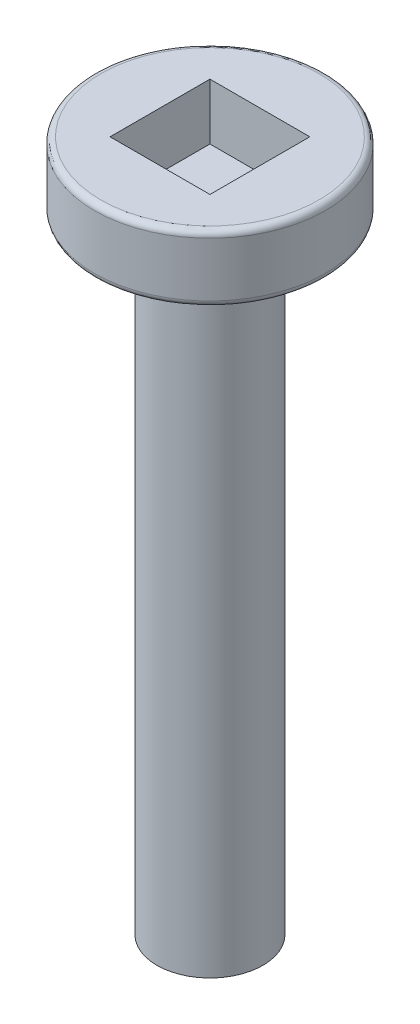
ISO-10303-21;
HEADER;
FILE_DESCRIPTION(('STEP AP214'),'2;1');
FILE_NAME('part.step','',(''),(''),'','','');
FILE_SCHEMA(('AUTOMOTIVE_DESIGN { 1 0 10303 214 1 1 1 1 }'));
ENDSEC;
DATA;
#1=APPLICATION_CONTEXT('core data for automotive mechanical design processes');
#2=APPLICATION_PROTOCOL_DEFINITION('international standard','automotive_design',2000,#1);
#3=PRODUCT_CONTEXT('',#1,'mechanical');
#4=PRODUCT('Part','Part','',(#3));
#5=PRODUCT_RELATED_PRODUCT_CATEGORY('part','',(#4));
#6=PRODUCT_DEFINITION_FORMATION('','',#4);
#7=PRODUCT_DEFINITION_CONTEXT('part definition',#1,'design');
#8=PRODUCT_DEFINITION('design','',#6,#7);
#9=PRODUCT_DEFINITION_SHAPE('','',#8);
#10=(LENGTH_UNIT() NAMED_UNIT(*) SI_UNIT(.MILLI.,.METRE.));
#11=(NAMED_UNIT(*) PLANE_ANGLE_UNIT() SI_UNIT($,.RADIAN.));
#12=(NAMED_UNIT(*) SI_UNIT($,.STERADIAN.) SOLID_ANGLE_UNIT());
#13=UNCERTAINTY_MEASURE_WITH_UNIT(LENGTH_MEASURE(1.E-05),#10,'distance_accuracy_value','');
#14=(GEOMETRIC_REPRESENTATION_CONTEXT(3) GLOBAL_UNCERTAINTY_ASSIGNED_CONTEXT((#13)) GLOBAL_UNIT_ASSIGNED_CONTEXT((#10,
#11,#12)) REPRESENTATION_CONTEXT('',''));
#15=CARTESIAN_POINT('',(0.,0.,0.));
#16=DIRECTION('',(0.,0.,1.));
#17=DIRECTION('',(1.,0.,0.));
#18=AXIS2_PLACEMENT_3D('',#15,#16,#17);
#19=CARTESIAN_POINT('',(0.,-2.7178,0.));
#20=DIRECTION('',(0.,1.,0.));
#21=DIRECTION('',(0.,0.,1.));
#22=AXIS2_PLACEMENT_3D('',#19,#20,#21);
#23=CYLINDRICAL_SURFACE('',#22,4.699);
#24=CARTESIAN_POINT('',(0.,-2.4638,0.));
#25=DIRECTION('',(0.,1.,0.));
#26=DIRECTION('',(0.,0.,1.));
#27=AXIS2_PLACEMENT_3D('',#24,#25,#26);
#28=CIRCLE('',#27,4.699);
#29=CARTESIAN_POINT('',(0.,-2.4638,4.699));
#30=VERTEX_POINT('',#29);
#31=EDGE_CURVE('E122',#30,#30,#28,.T.);
#32=ORIENTED_EDGE('',*,*,#31,.T.);
#33=EDGE_LOOP('',(#32));
#34=FACE_BOUND('',#33,.T.);
#35=CARTESIAN_POINT('',(0.,-0.254,0.));
#36=DIRECTION('',(0.,1.,0.));
#37=DIRECTION('',(0.,0.,1.));
#38=AXIS2_PLACEMENT_3D('',#35,#36,#37);
#39=CIRCLE('',#38,4.699);
#40=CARTESIAN_POINT('',(0.,-0.254,4.699));
#41=VERTEX_POINT('',#40);
#42=EDGE_CURVE('E119',#41,#41,#39,.F.);
#43=ORIENTED_EDGE('',*,*,#42,.T.);
#44=EDGE_LOOP('',(#43));
#45=FACE_BOUND('',#44,.T.);
#46=ADVANCED_FACE('F35',(#34,#45),#23,.T.);
#47=CARTESIAN_POINT('',(0.,-2.7178,0.));
#48=DIRECTION('',(0.,1.,0.));
#49=DIRECTION('',(0.,0.,1.));
#50=AXIS2_PLACEMENT_3D('',#47,#48,#49);
#51=PLANE('',#50);
#52=CARTESIAN_POINT('',(0.,-2.7178,0.));
#53=DIRECTION('',(0.,1.,0.));
#54=DIRECTION('',(0.,0.,1.));
#55=AXIS2_PLACEMENT_3D('',#52,#53,#54);
#56=CIRCLE('',#55,4.445);
#57=CARTESIAN_POINT('',(0.,-2.7178,4.445));
#58=VERTEX_POINT('',#57);
#59=EDGE_CURVE('E43',#58,#58,#56,.F.);
#60=ORIENTED_EDGE('',*,*,#59,.T.);
#61=EDGE_LOOP('',(#60));
#62=FACE_BOUND('',#61,.T.);
#63=CARTESIAN_POINT('',(0.,-2.7178,0.));
#64=DIRECTION('',(0.,1.,0.));
#65=DIRECTION('',(0.,0.,1.));
#66=AXIS2_PLACEMENT_3D('',#63,#64,#65);
#67=CIRCLE('',#66,2.159);
#68=CARTESIAN_POINT('',(0.,-2.7178,2.159));
#69=VERTEX_POINT('',#68);
#70=EDGE_CURVE('E116',#69,#69,#67,.T.);
#71=ORIENTED_EDGE('',*,*,#70,.T.);
#72=EDGE_LOOP('',(#71));
#73=FACE_BOUND('',#72,.T.);
#74=ADVANCED_FACE('F127',(#62,#73),#51,.F.);
#75=CARTESIAN_POINT('',(0.,0.,0.));
#76=DIRECTION('',(0.,1.,0.));
#77=DIRECTION('',(0.,0.,1.));
#78=AXIS2_PLACEMENT_3D('',#75,#76,#77);
#79=PLANE('',#78);
#80=CARTESIAN_POINT('',(0.,0.,0.));
#81=DIRECTION('',(0.,1.,0.));
#82=DIRECTION('',(0.,0.,1.));
#83=AXIS2_PLACEMENT_3D('',#80,#81,#82);
#84=CIRCLE('',#83,4.445);
#85=CARTESIAN_POINT('',(0.,0.,4.445));
#86=VERTEX_POINT('',#85);
#87=EDGE_CURVE('E11',#86,#86,#84,.T.);
#88=ORIENTED_EDGE('',*,*,#87,.T.);
#89=EDGE_LOOP('',(#88));
#90=FACE_BOUND('',#89,.T.);
#91=DIRECTION('',(0.,0.,1.));
#92=VECTOR('',#91,1.);
#93=CARTESIAN_POINT('',(-2.032,0.,-2.032));
#94=LINE('',#93,#92);
#95=CARTESIAN_POINT('',(-2.032,0.,-2.032));
#96=VERTEX_POINT('',#95);
#97=CARTESIAN_POINT('',(-2.032,0.,2.032));
#98=VERTEX_POINT('',#97);
#99=EDGE_CURVE('E50',#96,#98,#94,.T.);
#100=ORIENTED_EDGE('',*,*,#99,.F.);
#101=DIRECTION('',(-1.,0.,0.));
#102=VECTOR('',#101,1.);
#103=CARTESIAN_POINT('',(-2.032,0.,-2.032));
#104=LINE('',#103,#102);
#105=CARTESIAN_POINT('',(2.032,0.,-2.032));
#106=VERTEX_POINT('',#105);
#107=EDGE_CURVE('E101',#106,#96,#104,.T.);
#108=ORIENTED_EDGE('',*,*,#107,.F.);
#109=DIRECTION('',(0.,0.,-1.));
#110=VECTOR('',#109,1.);
#111=CARTESIAN_POINT('',(2.032,0.,-2.032));
#112=LINE('',#111,#110);
#113=CARTESIAN_POINT('',(2.032,0.,2.032));
#114=VERTEX_POINT('',#113);
#115=EDGE_CURVE('E107',#114,#106,#112,.T.);
#116=ORIENTED_EDGE('',*,*,#115,.F.);
#117=DIRECTION('',(1.,0.,0.));
#118=VECTOR('',#117,1.);
#119=CARTESIAN_POINT('',(-2.032,0.,2.032));
#120=LINE('',#119,#118);
#121=EDGE_CURVE('E85',#98,#114,#120,.T.);
#122=ORIENTED_EDGE('',*,*,#121,.F.);
#123=EDGE_LOOP('',(#100,#108,#116,#122));
#124=FACE_BOUND('',#123,.T.);
#125=ADVANCED_FACE('F144',(#90,#124),#79,.T.);
#126=CARTESIAN_POINT('',(0.,-28.1178,0.));
#127=DIRECTION('',(0.,1.,0.));
#128=DIRECTION('',(0.,0.,1.));
#129=AXIS2_PLACEMENT_3D('',#126,#127,#128);
#130=CYLINDRICAL_SURFACE('',#129,2.159);
#131=CARTESIAN_POINT('',(0.,-28.1178,0.));
#132=DIRECTION('',(0.,1.,0.));
#133=DIRECTION('',(0.,0.,1.));
#134=AXIS2_PLACEMENT_3D('',#131,#132,#133);
#135=CIRCLE('',#134,2.159);
#136=CARTESIAN_POINT('',(0.,-28.1178,2.159));
#137=VERTEX_POINT('',#136);
#138=EDGE_CURVE('E111',#137,#137,#135,.T.);
#139=ORIENTED_EDGE('',*,*,#138,.T.);
#140=EDGE_LOOP('',(#139));
#141=FACE_BOUND('',#140,.T.);
#142=ORIENTED_EDGE('',*,*,#70,.F.);
#143=EDGE_LOOP('',(#142));
#144=FACE_BOUND('',#143,.T.);
#145=ADVANCED_FACE('F147',(#141,#144),#130,.T.);
#146=CARTESIAN_POINT('',(0.,-28.1178,0.));
#147=DIRECTION('',(0.,1.,0.));
#148=DIRECTION('',(0.,0.,1.));
#149=AXIS2_PLACEMENT_3D('',#146,#147,#148);
#150=PLANE('',#149);
#151=ORIENTED_EDGE('',*,*,#138,.F.);
#152=EDGE_LOOP('',(#151));
#153=FACE_BOUND('',#152,.T.);
#154=ADVANCED_FACE('F159',(#153),#150,.F.);
#155=CARTESIAN_POINT('',(-2.032,-2.286,-2.032));
#156=DIRECTION('',(-1.,0.,0.));
#157=DIRECTION('',(0.,0.,1.));
#158=AXIS2_PLACEMENT_3D('',#155,#156,#157);
#159=PLANE('',#158);
#160=ORIENTED_EDGE('',*,*,#99,.T.);
#161=DIRECTION('',(0.,1.,0.));
#162=VECTOR('',#161,1.);
#163=CARTESIAN_POINT('',(-2.032,-2.286,2.032));
#164=LINE('',#163,#162);
#165=CARTESIAN_POINT('',(-2.032,-2.286,2.032));
#166=VERTEX_POINT('',#165);
#167=EDGE_CURVE('E73',#166,#98,#164,.T.);
#168=ORIENTED_EDGE('',*,*,#167,.F.);
#169=DIRECTION('',(0.,0.,1.));
#170=VECTOR('',#169,1.);
#171=CARTESIAN_POINT('',(-2.032,-2.286,-2.032));
#172=LINE('',#171,#170);
#173=CARTESIAN_POINT('',(-2.032,-2.286,-2.032));
#174=VERTEX_POINT('',#173);
#175=EDGE_CURVE('E99',#174,#166,#172,.T.);
#176=ORIENTED_EDGE('',*,*,#175,.F.);
#177=DIRECTION('',(0.,1.,0.));
#178=VECTOR('',#177,1.);
#179=CARTESIAN_POINT('',(-2.032,-2.286,-2.032));
#180=LINE('',#179,#178);
#181=EDGE_CURVE('E58',#174,#96,#180,.T.);
#182=ORIENTED_EDGE('',*,*,#181,.T.);
#183=EDGE_LOOP('',(#160,#168,#176,#182));
#184=FACE_BOUND('',#183,.T.);
#185=ADVANCED_FACE('F152',(#184),#159,.F.);
#186=CARTESIAN_POINT('',(-2.032,-2.286,-2.032));
#187=DIRECTION('',(0.,0.,-1.));
#188=DIRECTION('',(-1.,0.,0.));
#189=AXIS2_PLACEMENT_3D('',#186,#187,#188);
#190=PLANE('',#189);
#191=ORIENTED_EDGE('',*,*,#107,.T.);
#192=ORIENTED_EDGE('',*,*,#181,.F.);
#193=DIRECTION('',(-1.,0.,0.));
#194=VECTOR('',#193,1.);
#195=CARTESIAN_POINT('',(-2.032,-2.286,-2.032));
#196=LINE('',#195,#194);
#197=CARTESIAN_POINT('',(2.032,-2.286,-2.032));
#198=VERTEX_POINT('',#197);
#199=EDGE_CURVE('E96',#198,#174,#196,.T.);
#200=ORIENTED_EDGE('',*,*,#199,.F.);
#201=DIRECTION('',(0.,1.,0.));
#202=VECTOR('',#201,1.);
#203=CARTESIAN_POINT('',(2.032,-2.286,-2.032));
#204=LINE('',#203,#202);
#205=EDGE_CURVE('E89',#198,#106,#204,.T.);
#206=ORIENTED_EDGE('',*,*,#205,.T.);
#207=EDGE_LOOP('',(#191,#192,#200,#206));
#208=FACE_BOUND('',#207,.T.);
#209=ADVANCED_FACE('F150',(#208),#190,.F.);
#210=CARTESIAN_POINT('',(2.032,-2.286,-2.032));
#211=DIRECTION('',(1.,0.,0.));
#212=DIRECTION('',(0.,0.,-1.));
#213=AXIS2_PLACEMENT_3D('',#210,#211,#212);
#214=PLANE('',#213);
#215=ORIENTED_EDGE('',*,*,#115,.T.);
#216=ORIENTED_EDGE('',*,*,#205,.F.);
#217=DIRECTION('',(0.,0.,-1.));
#218=VECTOR('',#217,1.);
#219=CARTESIAN_POINT('',(2.032,-2.286,-2.032));
#220=LINE('',#219,#218);
#221=CARTESIAN_POINT('',(2.032,-2.286,2.032));
#222=VERTEX_POINT('',#221);
#223=EDGE_CURVE('E92',#222,#198,#220,.T.);
#224=ORIENTED_EDGE('',*,*,#223,.F.);
#225=DIRECTION('',(0.,1.,0.));
#226=VECTOR('',#225,1.);
#227=CARTESIAN_POINT('',(2.032,-2.286,2.032));
#228=LINE('',#227,#226);
#229=EDGE_CURVE('E78',#222,#114,#228,.T.);
#230=ORIENTED_EDGE('',*,*,#229,.T.);
#231=EDGE_LOOP('',(#215,#216,#224,#230));
#232=FACE_BOUND('',#231,.T.);
#233=ADVANCED_FACE('F93',(#232),#214,.F.);
#234=CARTESIAN_POINT('',(-2.032,-2.286,2.032));
#235=DIRECTION('',(0.,0.,1.));
#236=DIRECTION('',(1.,0.,0.));
#237=AXIS2_PLACEMENT_3D('',#234,#235,#236);
#238=PLANE('',#237);
#239=ORIENTED_EDGE('',*,*,#121,.T.);
#240=ORIENTED_EDGE('',*,*,#229,.F.);
#241=DIRECTION('',(1.,0.,0.));
#242=VECTOR('',#241,1.);
#243=CARTESIAN_POINT('',(-2.032,-2.286,2.032));
#244=LINE('',#243,#242);
#245=EDGE_CURVE('E82',#166,#222,#244,.T.);
#246=ORIENTED_EDGE('',*,*,#245,.F.);
#247=ORIENTED_EDGE('',*,*,#167,.T.);
#248=EDGE_LOOP('',(#239,#240,#246,#247));
#249=FACE_BOUND('',#248,.T.);
#250=ADVANCED_FACE('F80',(#249),#238,.F.);
#251=CARTESIAN_POINT('',(0.,-2.286,0.));
#252=DIRECTION('',(0.,1.,0.));
#253=DIRECTION('',(0.,0.,1.));
#254=AXIS2_PLACEMENT_3D('',#251,#252,#253);
#255=PLANE('',#254);
#256=ORIENTED_EDGE('',*,*,#175,.T.);
#257=ORIENTED_EDGE('',*,*,#245,.T.);
#258=ORIENTED_EDGE('',*,*,#223,.T.);
#259=ORIENTED_EDGE('',*,*,#199,.T.);
#260=EDGE_LOOP('',(#256,#257,#258,#259));
#261=FACE_BOUND('',#260,.T.);
#262=ADVANCED_FACE('F98',(#261),#255,.T.);
#263=CARTESIAN_POINT('',(0.,-2.4638,0.));
#264=DIRECTION('',(0.,1.,0.));
#265=DIRECTION('',(0.,0.,1.));
#266=AXIS2_PLACEMENT_3D('',#263,#264,#265);
#267=TOROIDAL_SURFACE('',#266,4.445,0.254);
#268=ORIENTED_EDGE('',*,*,#59,.F.);
#269=EDGE_LOOP('',(#268));
#270=FACE_BOUND('',#269,.T.);
#271=ORIENTED_EDGE('',*,*,#31,.F.);
#272=EDGE_LOOP('',(#271));
#273=FACE_BOUND('',#272,.T.);
#274=ADVANCED_FACE('F130',(#270,#273),#267,.T.);
#275=CARTESIAN_POINT('',(0.,-0.254,0.));
#276=DIRECTION('',(0.,1.,0.));
#277=DIRECTION('',(0.,0.,1.));
#278=AXIS2_PLACEMENT_3D('',#275,#276,#277);
#279=TOROIDAL_SURFACE('',#278,4.445,0.254);
#280=ORIENTED_EDGE('',*,*,#42,.F.);
#281=EDGE_LOOP('',(#280));
#282=FACE_BOUND('',#281,.T.);
#283=ORIENTED_EDGE('',*,*,#87,.F.);
#284=EDGE_LOOP('',(#283));
#285=FACE_BOUND('',#284,.T.);
#286=ADVANCED_FACE('F37',(#282,#285),#279,.T.);
#287=CLOSED_SHELL('',(#46,#74,#125,#145,#154,#185,#209,#233,#250,#262,#274,#286));
#288=MANIFOLD_SOLID_BREP('B2',#287);
#289=ADVANCED_BREP_SHAPE_REPRESENTATION('',(#18,#288),#14);
#290=SHAPE_DEFINITION_REPRESENTATION(#9,#289);
ENDSEC;
END-ISO-10303-21;
